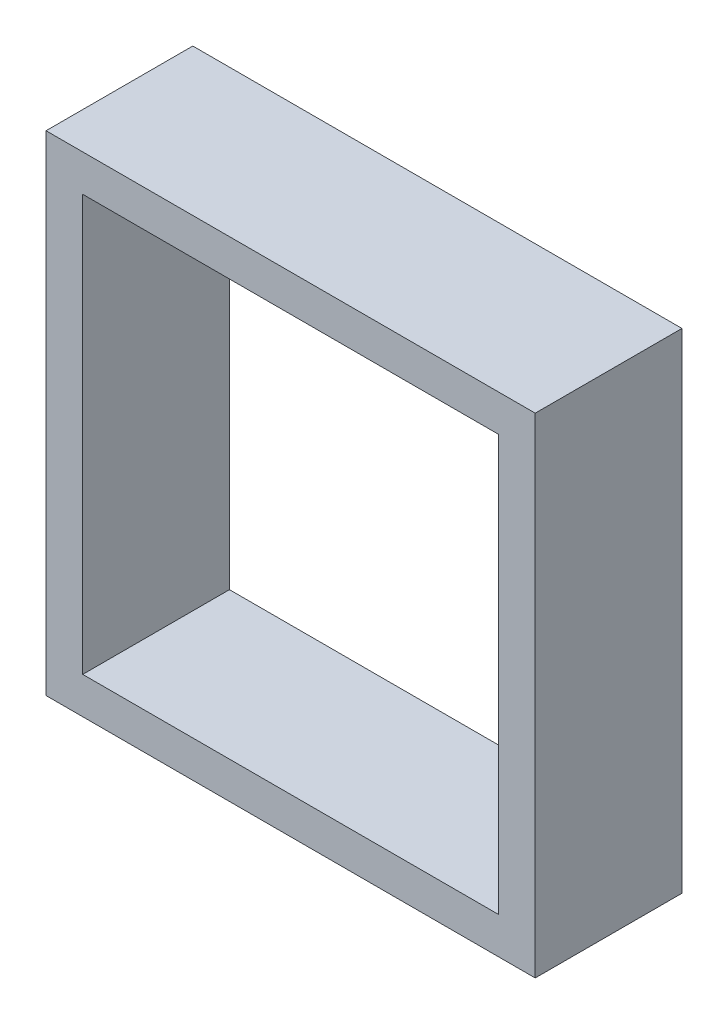
ISO-10303-21;
HEADER;
FILE_DESCRIPTION(('STEP AP214'),'2;1');
FILE_NAME('part.step','',(''),(''),'','','');
FILE_SCHEMA(('AUTOMOTIVE_DESIGN { 1 0 10303 214 1 1 1 1 }'));
ENDSEC;
DATA;
#1=APPLICATION_CONTEXT('core data for automotive mechanical design processes');
#2=APPLICATION_PROTOCOL_DEFINITION('international standard','automotive_design',2000,#1);
#3=PRODUCT_CONTEXT('',#1,'mechanical');
#4=PRODUCT('Part','Part','',(#3));
#5=PRODUCT_RELATED_PRODUCT_CATEGORY('part','',(#4));
#6=PRODUCT_DEFINITION_FORMATION('','',#4);
#7=PRODUCT_DEFINITION_CONTEXT('part definition',#1,'design');
#8=PRODUCT_DEFINITION('design','',#6,#7);
#9=PRODUCT_DEFINITION_SHAPE('','',#8);
#10=(LENGTH_UNIT() NAMED_UNIT(*) SI_UNIT(.MILLI.,.METRE.));
#11=(NAMED_UNIT(*) PLANE_ANGLE_UNIT() SI_UNIT($,.RADIAN.));
#12=(NAMED_UNIT(*) SI_UNIT($,.STERADIAN.) SOLID_ANGLE_UNIT());
#13=UNCERTAINTY_MEASURE_WITH_UNIT(LENGTH_MEASURE(1.E-05),#10,'distance_accuracy_value','');
#14=(GEOMETRIC_REPRESENTATION_CONTEXT(3) GLOBAL_UNCERTAINTY_ASSIGNED_CONTEXT((#13)) GLOBAL_UNIT_ASSIGNED_CONTEXT((#10,
#11,#12)) REPRESENTATION_CONTEXT('',''));
#15=CARTESIAN_POINT('',(0.,0.,0.));
#16=DIRECTION('',(0.,0.,1.));
#17=DIRECTION('',(1.,0.,0.));
#18=AXIS2_PLACEMENT_3D('',#15,#16,#17);
#19=CARTESIAN_POINT('',(0.,0.,152.4));
#20=DIRECTION('',(0.,0.,-1.));
#21=DIRECTION('',(-1.,0.,0.));
#22=AXIS2_PLACEMENT_3D('',#19,#20,#21);
#23=PLANE('',#22);
#24=DIRECTION('',(0.,-1.,0.));
#25=VECTOR('',#24,1.);
#26=CARTESIAN_POINT('',(0.,0.,152.4));
#27=LINE('',#26,#25);
#28=CARTESIAN_POINT('',(0.,508.,152.4));
#29=VERTEX_POINT('',#28);
#30=CARTESIAN_POINT('',(0.,0.,152.4));
#31=VERTEX_POINT('',#30);
#32=EDGE_CURVE('E135',#29,#31,#27,.T.);
#33=ORIENTED_EDGE('',*,*,#32,.T.);
#34=DIRECTION('',(1.,0.,0.));
#35=VECTOR('',#34,1.);
#36=CARTESIAN_POINT('',(0.,0.,152.4));
#37=LINE('',#36,#35);
#38=CARTESIAN_POINT('',(508.,0.,152.4));
#39=VERTEX_POINT('',#38);
#40=EDGE_CURVE('E138',#31,#39,#37,.T.);
#41=ORIENTED_EDGE('',*,*,#40,.T.);
#42=DIRECTION('',(0.,1.,0.));
#43=VECTOR('',#42,1.);
#44=CARTESIAN_POINT('',(508.,0.,152.4));
#45=LINE('',#44,#43);
#46=CARTESIAN_POINT('',(508.,508.,152.4));
#47=VERTEX_POINT('',#46);
#48=EDGE_CURVE('E141',#39,#47,#45,.T.);
#49=ORIENTED_EDGE('',*,*,#48,.T.);
#50=DIRECTION('',(-1.,0.,0.));
#51=VECTOR('',#50,1.);
#52=CARTESIAN_POINT('',(0.,508.,152.4));
#53=LINE('',#52,#51);
#54=EDGE_CURVE('E143',#47,#29,#53,.T.);
#55=ORIENTED_EDGE('',*,*,#54,.T.);
#56=EDGE_LOOP('',(#33,#41,#49,#55));
#57=FACE_BOUND('',#56,.T.);
#58=DIRECTION('',(1.,0.,0.));
#59=VECTOR('',#58,1.);
#60=CARTESIAN_POINT('',(38.1,38.1,152.4));
#61=LINE('',#60,#59);
#62=CARTESIAN_POINT('',(38.1,38.1,152.4));
#63=VERTEX_POINT('',#62);
#64=CARTESIAN_POINT('',(469.9,38.1,152.4));
#65=VERTEX_POINT('',#64);
#66=EDGE_CURVE('E99',#63,#65,#61,.T.);
#67=ORIENTED_EDGE('',*,*,#66,.F.);
#68=DIRECTION('',(0.,-1.,0.));
#69=VECTOR('',#68,1.);
#70=CARTESIAN_POINT('',(38.1,38.1,152.4));
#71=LINE('',#70,#69);
#72=CARTESIAN_POINT('',(38.1,469.9,152.4));
#73=VERTEX_POINT('',#72);
#74=EDGE_CURVE('E121',#73,#63,#71,.T.);
#75=ORIENTED_EDGE('',*,*,#74,.F.);
#76=DIRECTION('',(-1.,0.,0.));
#77=VECTOR('',#76,1.);
#78=CARTESIAN_POINT('',(38.1,469.9,152.4));
#79=LINE('',#78,#77);
#80=CARTESIAN_POINT('',(469.9,469.9,152.4));
#81=VERTEX_POINT('',#80);
#82=EDGE_CURVE('E119',#81,#73,#79,.T.);
#83=ORIENTED_EDGE('',*,*,#82,.F.);
#84=DIRECTION('',(0.,1.,0.));
#85=VECTOR('',#84,1.);
#86=CARTESIAN_POINT('',(469.9,38.1,152.4));
#87=LINE('',#86,#85);
#88=EDGE_CURVE('E107',#65,#81,#87,.T.);
#89=ORIENTED_EDGE('',*,*,#88,.F.);
#90=EDGE_LOOP('',(#67,#75,#83,#89));
#91=FACE_BOUND('',#90,.T.);
#92=ADVANCED_FACE('F34',(#57,#91),#23,.F.);
#93=CARTESIAN_POINT('',(0.,0.,0.));
#94=DIRECTION('',(0.,0.,-1.));
#95=DIRECTION('',(-1.,0.,0.));
#96=AXIS2_PLACEMENT_3D('',#93,#94,#95);
#97=PLANE('',#96);
#98=DIRECTION('',(0.,-1.,0.));
#99=VECTOR('',#98,1.);
#100=CARTESIAN_POINT('',(0.,0.,0.));
#101=LINE('',#100,#99);
#102=CARTESIAN_POINT('',(0.,508.,0.));
#103=VERTEX_POINT('',#102);
#104=CARTESIAN_POINT('',(0.,0.,0.));
#105=VERTEX_POINT('',#104);
#106=EDGE_CURVE('E115',#103,#105,#101,.T.);
#107=ORIENTED_EDGE('',*,*,#106,.F.);
#108=DIRECTION('',(-1.,0.,0.));
#109=VECTOR('',#108,1.);
#110=CARTESIAN_POINT('',(0.,508.,0.));
#111=LINE('',#110,#109);
#112=CARTESIAN_POINT('',(508.,508.,0.));
#113=VERTEX_POINT('',#112);
#114=EDGE_CURVE('E139',#113,#103,#111,.T.);
#115=ORIENTED_EDGE('',*,*,#114,.F.);
#116=DIRECTION('',(0.,1.,0.));
#117=VECTOR('',#116,1.);
#118=CARTESIAN_POINT('',(508.,0.,0.));
#119=LINE('',#118,#117);
#120=CARTESIAN_POINT('',(508.,0.,0.));
#121=VERTEX_POINT('',#120);
#122=EDGE_CURVE('E150',#121,#113,#119,.T.);
#123=ORIENTED_EDGE('',*,*,#122,.F.);
#124=DIRECTION('',(1.,0.,0.));
#125=VECTOR('',#124,1.);
#126=CARTESIAN_POINT('',(0.,0.,0.));
#127=LINE('',#126,#125);
#128=EDGE_CURVE('E148',#105,#121,#127,.T.);
#129=ORIENTED_EDGE('',*,*,#128,.F.);
#130=EDGE_LOOP('',(#107,#115,#123,#129));
#131=FACE_BOUND('',#130,.T.);
#132=DIRECTION('',(0.,-1.,0.));
#133=VECTOR('',#132,1.);
#134=CARTESIAN_POINT('',(38.1,38.1,0.));
#135=LINE('',#134,#133);
#136=CARTESIAN_POINT('',(38.1,469.9,0.));
#137=VERTEX_POINT('',#136);
#138=CARTESIAN_POINT('',(38.1,38.1,0.));
#139=VERTEX_POINT('',#138);
#140=EDGE_CURVE('E108',#137,#139,#135,.T.);
#141=ORIENTED_EDGE('',*,*,#140,.T.);
#142=DIRECTION('',(1.,0.,0.));
#143=VECTOR('',#142,1.);
#144=CARTESIAN_POINT('',(38.1,38.1,0.));
#145=LINE('',#144,#143);
#146=CARTESIAN_POINT('',(469.9,38.1,0.));
#147=VERTEX_POINT('',#146);
#148=EDGE_CURVE('E57',#139,#147,#145,.T.);
#149=ORIENTED_EDGE('',*,*,#148,.T.);
#150=DIRECTION('',(0.,1.,0.));
#151=VECTOR('',#150,1.);
#152=CARTESIAN_POINT('',(469.9,38.1,0.));
#153=LINE('',#152,#151);
#154=CARTESIAN_POINT('',(469.9,469.9,0.));
#155=VERTEX_POINT('',#154);
#156=EDGE_CURVE('E114',#147,#155,#153,.T.);
#157=ORIENTED_EDGE('',*,*,#156,.T.);
#158=DIRECTION('',(-1.,0.,0.));
#159=VECTOR('',#158,1.);
#160=CARTESIAN_POINT('',(38.1,469.9,0.));
#161=LINE('',#160,#159);
#162=EDGE_CURVE('E127',#155,#137,#161,.T.);
#163=ORIENTED_EDGE('',*,*,#162,.T.);
#164=EDGE_LOOP('',(#141,#149,#157,#163));
#165=FACE_BOUND('',#164,.T.);
#166=ADVANCED_FACE('F168',(#131,#165),#97,.T.);
#167=CARTESIAN_POINT('',(0.,0.,152.4));
#168=DIRECTION('',(1.,0.,0.));
#169=DIRECTION('',(0.,0.,-1.));
#170=AXIS2_PLACEMENT_3D('',#167,#168,#169);
#171=PLANE('',#170);
#172=ORIENTED_EDGE('',*,*,#106,.T.);
#173=DIRECTION('',(0.,0.,-1.));
#174=VECTOR('',#173,1.);
#175=CARTESIAN_POINT('',(0.,0.,152.4));
#176=LINE('',#175,#174);
#177=EDGE_CURVE('E11',#31,#105,#176,.T.);
#178=ORIENTED_EDGE('',*,*,#177,.F.);
#179=ORIENTED_EDGE('',*,*,#32,.F.);
#180=DIRECTION('',(0.,0.,-1.));
#181=VECTOR('',#180,1.);
#182=CARTESIAN_POINT('',(0.,508.,152.4));
#183=LINE('',#182,#181);
#184=EDGE_CURVE('E145',#29,#103,#183,.T.);
#185=ORIENTED_EDGE('',*,*,#184,.T.);
#186=EDGE_LOOP('',(#172,#178,#179,#185));
#187=FACE_BOUND('',#186,.T.);
#188=ADVANCED_FACE('F36',(#187),#171,.F.);
#189=CARTESIAN_POINT('',(0.,0.,152.4));
#190=DIRECTION('',(0.,1.,0.));
#191=DIRECTION('',(0.,0.,1.));
#192=AXIS2_PLACEMENT_3D('',#189,#190,#191);
#193=PLANE('',#192);
#194=ORIENTED_EDGE('',*,*,#128,.T.);
#195=DIRECTION('',(0.,0.,-1.));
#196=VECTOR('',#195,1.);
#197=CARTESIAN_POINT('',(508.,0.,152.4));
#198=LINE('',#197,#196);
#199=EDGE_CURVE('E42',#39,#121,#198,.T.);
#200=ORIENTED_EDGE('',*,*,#199,.F.);
#201=ORIENTED_EDGE('',*,*,#40,.F.);
#202=ORIENTED_EDGE('',*,*,#177,.T.);
#203=EDGE_LOOP('',(#194,#200,#201,#202));
#204=FACE_BOUND('',#203,.T.);
#205=ADVANCED_FACE('F178',(#204),#193,.F.);
#206=CARTESIAN_POINT('',(508.,0.,152.4));
#207=DIRECTION('',(-1.,0.,0.));
#208=DIRECTION('',(0.,0.,1.));
#209=AXIS2_PLACEMENT_3D('',#206,#207,#208);
#210=PLANE('',#209);
#211=ORIENTED_EDGE('',*,*,#122,.T.);
#212=DIRECTION('',(0.,0.,-1.));
#213=VECTOR('',#212,1.);
#214=CARTESIAN_POINT('',(508.,508.,152.4));
#215=LINE('',#214,#213);
#216=EDGE_CURVE('E155',#47,#113,#215,.T.);
#217=ORIENTED_EDGE('',*,*,#216,.F.);
#218=ORIENTED_EDGE('',*,*,#48,.F.);
#219=ORIENTED_EDGE('',*,*,#199,.T.);
#220=EDGE_LOOP('',(#211,#217,#218,#219));
#221=FACE_BOUND('',#220,.T.);
#222=ADVANCED_FACE('F162',(#221),#210,.F.);
#223=CARTESIAN_POINT('',(0.,508.,152.4));
#224=DIRECTION('',(0.,-1.,0.));
#225=DIRECTION('',(0.,0.,-1.));
#226=AXIS2_PLACEMENT_3D('',#223,#224,#225);
#227=PLANE('',#226);
#228=ORIENTED_EDGE('',*,*,#114,.T.);
#229=ORIENTED_EDGE('',*,*,#184,.F.);
#230=ORIENTED_EDGE('',*,*,#54,.F.);
#231=ORIENTED_EDGE('',*,*,#216,.T.);
#232=EDGE_LOOP('',(#228,#229,#230,#231));
#233=FACE_BOUND('',#232,.T.);
#234=ADVANCED_FACE('F172',(#233),#227,.F.);
#235=CARTESIAN_POINT('',(38.1,38.1,152.4));
#236=DIRECTION('',(0.,1.,0.));
#237=DIRECTION('',(0.,0.,1.));
#238=AXIS2_PLACEMENT_3D('',#235,#236,#237);
#239=PLANE('',#238);
#240=ORIENTED_EDGE('',*,*,#148,.F.);
#241=DIRECTION('',(0.,0.,-1.));
#242=VECTOR('',#241,1.);
#243=CARTESIAN_POINT('',(38.1,38.1,152.4));
#244=LINE('',#243,#242);
#245=EDGE_CURVE('E103',#63,#139,#244,.T.);
#246=ORIENTED_EDGE('',*,*,#245,.F.);
#247=ORIENTED_EDGE('',*,*,#66,.T.);
#248=DIRECTION('',(0.,0.,-1.));
#249=VECTOR('',#248,1.);
#250=CARTESIAN_POINT('',(469.9,38.1,152.4));
#251=LINE('',#250,#249);
#252=EDGE_CURVE('E102',#65,#147,#251,.T.);
#253=ORIENTED_EDGE('',*,*,#252,.T.);
#254=EDGE_LOOP('',(#240,#246,#247,#253));
#255=FACE_BOUND('',#254,.T.);
#256=ADVANCED_FACE('F101',(#255),#239,.T.);
#257=CARTESIAN_POINT('',(469.9,38.1,152.4));
#258=DIRECTION('',(-1.,0.,0.));
#259=DIRECTION('',(0.,0.,1.));
#260=AXIS2_PLACEMENT_3D('',#257,#258,#259);
#261=PLANE('',#260);
#262=ORIENTED_EDGE('',*,*,#156,.F.);
#263=ORIENTED_EDGE('',*,*,#252,.F.);
#264=ORIENTED_EDGE('',*,*,#88,.T.);
#265=DIRECTION('',(0.,0.,-1.));
#266=VECTOR('',#265,1.);
#267=CARTESIAN_POINT('',(469.9,469.9,152.4));
#268=LINE('',#267,#266);
#269=EDGE_CURVE('E116',#81,#155,#268,.T.);
#270=ORIENTED_EDGE('',*,*,#269,.T.);
#271=EDGE_LOOP('',(#262,#263,#264,#270));
#272=FACE_BOUND('',#271,.T.);
#273=ADVANCED_FACE('F111',(#272),#261,.T.);
#274=CARTESIAN_POINT('',(38.1,469.9,152.4));
#275=DIRECTION('',(0.,-1.,0.));
#276=DIRECTION('',(0.,0.,-1.));
#277=AXIS2_PLACEMENT_3D('',#274,#275,#276);
#278=PLANE('',#277);
#279=ORIENTED_EDGE('',*,*,#162,.F.);
#280=ORIENTED_EDGE('',*,*,#269,.F.);
#281=ORIENTED_EDGE('',*,*,#82,.T.);
#282=DIRECTION('',(0.,0.,-1.));
#283=VECTOR('',#282,1.);
#284=CARTESIAN_POINT('',(38.1,469.9,152.4));
#285=LINE('',#284,#283);
#286=EDGE_CURVE('E49',#73,#137,#285,.T.);
#287=ORIENTED_EDGE('',*,*,#286,.T.);
#288=EDGE_LOOP('',(#279,#280,#281,#287));
#289=FACE_BOUND('',#288,.T.);
#290=ADVANCED_FACE('F201',(#289),#278,.T.);
#291=CARTESIAN_POINT('',(38.1,38.1,152.4));
#292=DIRECTION('',(1.,0.,0.));
#293=DIRECTION('',(0.,0.,-1.));
#294=AXIS2_PLACEMENT_3D('',#291,#292,#293);
#295=PLANE('',#294);
#296=ORIENTED_EDGE('',*,*,#140,.F.);
#297=ORIENTED_EDGE('',*,*,#286,.F.);
#298=ORIENTED_EDGE('',*,*,#74,.T.);
#299=ORIENTED_EDGE('',*,*,#245,.T.);
#300=EDGE_LOOP('',(#296,#297,#298,#299));
#301=FACE_BOUND('',#300,.T.);
#302=ADVANCED_FACE('F205',(#301),#295,.T.);
#303=CLOSED_SHELL('',(#92,#166,#188,#205,#222,#234,#256,#273,#290,#302));
#304=MANIFOLD_SOLID_BREP('B2',#303);
#305=ADVANCED_BREP_SHAPE_REPRESENTATION('',(#18,#304),#14);
#306=SHAPE_DEFINITION_REPRESENTATION(#9,#305);
ENDSEC;
END-ISO-10303-21;
